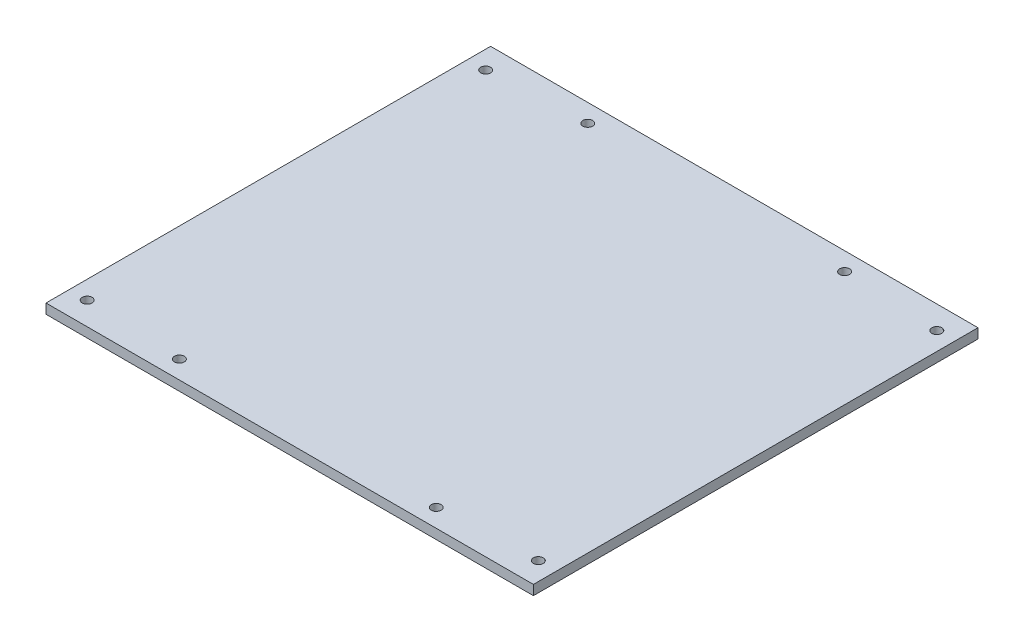
ISO-10303-21;
HEADER;
FILE_DESCRIPTION(('STEP AP214'),'2;1');
FILE_NAME('part.step','',(''),(''),'','','');
FILE_SCHEMA(('AUTOMOTIVE_DESIGN { 1 0 10303 214 1 1 1 1 }'));
ENDSEC;
DATA;
#1=APPLICATION_CONTEXT('core data for automotive mechanical design processes');
#2=APPLICATION_PROTOCOL_DEFINITION('international standard','automotive_design',2000,#1);
#3=PRODUCT_CONTEXT('',#1,'mechanical');
#4=PRODUCT('Part','Part','',(#3));
#5=PRODUCT_RELATED_PRODUCT_CATEGORY('part','',(#4));
#6=PRODUCT_DEFINITION_FORMATION('','',#4);
#7=PRODUCT_DEFINITION_CONTEXT('part definition',#1,'design');
#8=PRODUCT_DEFINITION('design','',#6,#7);
#9=PRODUCT_DEFINITION_SHAPE('','',#8);
#10=(LENGTH_UNIT() NAMED_UNIT(*) SI_UNIT(.MILLI.,.METRE.));
#11=(NAMED_UNIT(*) PLANE_ANGLE_UNIT() SI_UNIT($,.RADIAN.));
#12=(NAMED_UNIT(*) SI_UNIT($,.STERADIAN.) SOLID_ANGLE_UNIT());
#13=UNCERTAINTY_MEASURE_WITH_UNIT(LENGTH_MEASURE(1.E-05),#10,'distance_accuracy_value','');
#14=(GEOMETRIC_REPRESENTATION_CONTEXT(3) GLOBAL_UNCERTAINTY_ASSIGNED_CONTEXT((#13)) GLOBAL_UNIT_ASSIGNED_CONTEXT((#10,
#11,#12)) REPRESENTATION_CONTEXT('',''));
#15=CARTESIAN_POINT('',(0.,0.,0.));
#16=DIRECTION('',(0.,0.,1.));
#17=DIRECTION('',(1.,0.,0.));
#18=AXIS2_PLACEMENT_3D('',#15,#16,#17);
#19=CARTESIAN_POINT('',(-74.,2.9718,-60.));
#20=DIRECTION('',(1.,0.,0.));
#21=DIRECTION('',(0.,0.,-1.));
#22=AXIS2_PLACEMENT_3D('',#19,#20,#21);
#23=PLANE('',#22);
#24=DIRECTION('',(0.,0.,1.));
#25=VECTOR('',#24,1.);
#26=CARTESIAN_POINT('',(-74.,0.,-60.));
#27=LINE('',#26,#25);
#28=CARTESIAN_POINT('',(-74.,0.,-60.));
#29=VERTEX_POINT('',#28);
#30=CARTESIAN_POINT('',(-74.,0.,75.));
#31=VERTEX_POINT('',#30);
#32=EDGE_CURVE('E107',#29,#31,#27,.T.);
#33=ORIENTED_EDGE('',*,*,#32,.T.);
#34=DIRECTION('',(0.,-1.,0.));
#35=VECTOR('',#34,1.);
#36=CARTESIAN_POINT('',(-74.,2.9718,75.));
#37=LINE('',#36,#35);
#38=CARTESIAN_POINT('',(-74.,2.9718,75.));
#39=VERTEX_POINT('',#38);
#40=EDGE_CURVE('E11',#39,#31,#37,.T.);
#41=ORIENTED_EDGE('',*,*,#40,.F.);
#42=DIRECTION('',(0.,0.,1.));
#43=VECTOR('',#42,1.);
#44=CARTESIAN_POINT('',(-74.,2.9718,-60.));
#45=LINE('',#44,#43);
#46=CARTESIAN_POINT('',(-74.,2.9718,-60.));
#47=VERTEX_POINT('',#46);
#48=EDGE_CURVE('E91',#47,#39,#45,.T.);
#49=ORIENTED_EDGE('',*,*,#48,.F.);
#50=DIRECTION('',(0.,-1.,0.));
#51=VECTOR('',#50,1.);
#52=CARTESIAN_POINT('',(-74.,2.9718,-60.));
#53=LINE('',#52,#51);
#54=EDGE_CURVE('E103',#47,#29,#53,.T.);
#55=ORIENTED_EDGE('',*,*,#54,.T.);
#56=EDGE_LOOP('',(#33,#41,#49,#55));
#57=FACE_BOUND('',#56,.T.);
#58=ADVANCED_FACE('F39',(#57),#23,.F.);
#59=CARTESIAN_POINT('',(-74.,2.9718,75.));
#60=DIRECTION('',(0.,0.,-1.));
#61=DIRECTION('',(-1.,0.,0.));
#62=AXIS2_PLACEMENT_3D('',#59,#60,#61);
#63=PLANE('',#62);
#64=DIRECTION('',(1.,0.,0.));
#65=VECTOR('',#64,1.);
#66=CARTESIAN_POINT('',(-74.,0.,75.));
#67=LINE('',#66,#65);
#68=CARTESIAN_POINT('',(74.,0.,75.));
#69=VERTEX_POINT('',#68);
#70=EDGE_CURVE('E96',#31,#69,#67,.T.);
#71=ORIENTED_EDGE('',*,*,#70,.T.);
#72=DIRECTION('',(0.,-1.,0.));
#73=VECTOR('',#72,1.);
#74=CARTESIAN_POINT('',(74.,2.9718,75.));
#75=LINE('',#74,#73);
#76=CARTESIAN_POINT('',(74.,2.9718,75.));
#77=VERTEX_POINT('',#76);
#78=EDGE_CURVE('E48',#77,#69,#75,.T.);
#79=ORIENTED_EDGE('',*,*,#78,.F.);
#80=DIRECTION('',(1.,0.,0.));
#81=VECTOR('',#80,1.);
#82=CARTESIAN_POINT('',(-74.,2.9718,75.));
#83=LINE('',#82,#81);
#84=EDGE_CURVE('E86',#39,#77,#83,.T.);
#85=ORIENTED_EDGE('',*,*,#84,.F.);
#86=ORIENTED_EDGE('',*,*,#40,.T.);
#87=EDGE_LOOP('',(#71,#79,#85,#86));
#88=FACE_BOUND('',#87,.T.);
#89=ADVANCED_FACE('F95',(#88),#63,.F.);
#90=CARTESIAN_POINT('',(74.,2.9718,-60.));
#91=DIRECTION('',(-1.,0.,0.));
#92=DIRECTION('',(0.,0.,1.));
#93=AXIS2_PLACEMENT_3D('',#90,#91,#92);
#94=PLANE('',#93);
#95=DIRECTION('',(0.,0.,-1.));
#96=VECTOR('',#95,1.);
#97=CARTESIAN_POINT('',(74.,0.,-60.));
#98=LINE('',#97,#96);
#99=CARTESIAN_POINT('',(74.,0.,-60.));
#100=VERTEX_POINT('',#99);
#101=EDGE_CURVE('E73',#69,#100,#98,.T.);
#102=ORIENTED_EDGE('',*,*,#101,.T.);
#103=DIRECTION('',(0.,-1.,0.));
#104=VECTOR('',#103,1.);
#105=CARTESIAN_POINT('',(74.,2.9718,-60.));
#106=LINE('',#105,#104);
#107=CARTESIAN_POINT('',(74.,2.9718,-60.));
#108=VERTEX_POINT('',#107);
#109=EDGE_CURVE('E98',#108,#100,#106,.T.);
#110=ORIENTED_EDGE('',*,*,#109,.F.);
#111=DIRECTION('',(0.,0.,-1.));
#112=VECTOR('',#111,1.);
#113=CARTESIAN_POINT('',(74.,2.9718,-60.));
#114=LINE('',#113,#112);
#115=EDGE_CURVE('E89',#77,#108,#114,.T.);
#116=ORIENTED_EDGE('',*,*,#115,.F.);
#117=ORIENTED_EDGE('',*,*,#78,.T.);
#118=EDGE_LOOP('',(#102,#110,#116,#117));
#119=FACE_BOUND('',#118,.T.);
#120=ADVANCED_FACE('F99',(#119),#94,.F.);
#121=CARTESIAN_POINT('',(-74.,2.9718,-60.));
#122=DIRECTION('',(0.,0.,1.));
#123=DIRECTION('',(1.,0.,0.));
#124=AXIS2_PLACEMENT_3D('',#121,#122,#123);
#125=PLANE('',#124);
#126=DIRECTION('',(-1.,0.,0.));
#127=VECTOR('',#126,1.);
#128=CARTESIAN_POINT('',(-74.,0.,-60.));
#129=LINE('',#128,#127);
#130=EDGE_CURVE('E79',#100,#29,#129,.T.);
#131=ORIENTED_EDGE('',*,*,#130,.T.);
#132=ORIENTED_EDGE('',*,*,#54,.F.);
#133=DIRECTION('',(-1.,0.,0.));
#134=VECTOR('',#133,1.);
#135=CARTESIAN_POINT('',(-74.,2.9718,-60.));
#136=LINE('',#135,#134);
#137=EDGE_CURVE('E56',#108,#47,#136,.T.);
#138=ORIENTED_EDGE('',*,*,#137,.F.);
#139=ORIENTED_EDGE('',*,*,#109,.T.);
#140=EDGE_LOOP('',(#131,#132,#138,#139));
#141=FACE_BOUND('',#140,.T.);
#142=ADVANCED_FACE('F121',(#141),#125,.F.);
#143=CARTESIAN_POINT('',(0.,2.9718,0.));
#144=DIRECTION('',(0.,1.,0.));
#145=DIRECTION('',(0.,0.,1.));
#146=AXIS2_PLACEMENT_3D('',#143,#144,#145);
#147=PLANE('',#146);
#148=CARTESIAN_POINT('',(-68.5,2.9718,68.));
#149=DIRECTION('',(0.,1.,0.));
#150=DIRECTION('',(0.,0.,1.));
#151=AXIS2_PLACEMENT_3D('',#148,#149,#150);
#152=CIRCLE('',#151,1.5);
#153=CARTESIAN_POINT('',(-68.5,2.9718,69.5));
#154=VERTEX_POINT('',#153);
#155=EDGE_CURVE('E161',#154,#154,#152,.T.);
#156=ORIENTED_EDGE('',*,*,#155,.F.);
#157=EDGE_LOOP('',(#156));
#158=FACE_BOUND('',#157,.T.);
#159=CARTESIAN_POINT('',(68.5,2.9718,67.9999999999999));
#160=DIRECTION('',(0.,1.,0.));
#161=DIRECTION('',(0.,0.,-1.));
#162=AXIS2_PLACEMENT_3D('',#159,#160,#161);
#163=CIRCLE('',#162,1.5);
#164=CARTESIAN_POINT('',(68.5,2.9718,66.4999999999999));
#165=VERTEX_POINT('',#164);
#166=EDGE_CURVE('E153',#165,#165,#163,.T.);
#167=ORIENTED_EDGE('',*,*,#166,.F.);
#168=EDGE_LOOP('',(#167));
#169=FACE_BOUND('',#168,.T.);
#170=CARTESIAN_POINT('',(68.5,2.9718,-53.));
#171=DIRECTION('',(0.,1.,0.));
#172=DIRECTION('',(0.,0.,-1.));
#173=AXIS2_PLACEMENT_3D('',#170,#171,#172);
#174=CIRCLE('',#173,1.5);
#175=CARTESIAN_POINT('',(68.5,2.9718,-54.5));
#176=VERTEX_POINT('',#175);
#177=EDGE_CURVE('E145',#176,#176,#174,.T.);
#178=ORIENTED_EDGE('',*,*,#177,.F.);
#179=EDGE_LOOP('',(#178));
#180=FACE_BOUND('',#179,.T.);
#181=CARTESIAN_POINT('',(-39.,2.9718,-54.5));
#182=DIRECTION('',(0.,1.,0.));
#183=DIRECTION('',(0.,0.,1.));
#184=AXIS2_PLACEMENT_3D('',#181,#182,#183);
#185=CIRCLE('',#184,1.5);
#186=CARTESIAN_POINT('',(-39.,2.9718,-53.));
#187=VERTEX_POINT('',#186);
#188=EDGE_CURVE('E136',#187,#187,#185,.T.);
#189=ORIENTED_EDGE('',*,*,#188,.F.);
#190=EDGE_LOOP('',(#189));
#191=FACE_BOUND('',#190,.T.);
#192=CARTESIAN_POINT('',(39.,2.9718,69.5));
#193=DIRECTION('',(0.,1.,0.));
#194=DIRECTION('',(0.,0.,1.));
#195=AXIS2_PLACEMENT_3D('',#192,#193,#194);
#196=CIRCLE('',#195,1.5);
#197=CARTESIAN_POINT('',(39.,2.9718,71.));
#198=VERTEX_POINT('',#197);
#199=EDGE_CURVE('E184',#198,#198,#196,.T.);
#200=ORIENTED_EDGE('',*,*,#199,.F.);
#201=EDGE_LOOP('',(#200));
#202=FACE_BOUND('',#201,.T.);
#203=CARTESIAN_POINT('',(-39.,2.9718,69.5));
#204=DIRECTION('',(0.,1.,0.));
#205=DIRECTION('',(0.,0.,1.));
#206=AXIS2_PLACEMENT_3D('',#203,#204,#205);
#207=CIRCLE('',#206,1.5);
#208=CARTESIAN_POINT('',(-39.,2.9718,71.));
#209=VERTEX_POINT('',#208);
#210=EDGE_CURVE('E168',#209,#209,#207,.T.);
#211=ORIENTED_EDGE('',*,*,#210,.F.);
#212=EDGE_LOOP('',(#211));
#213=FACE_BOUND('',#212,.T.);
#214=CARTESIAN_POINT('',(39.,2.9718,-54.5));
#215=DIRECTION('',(0.,1.,0.));
#216=DIRECTION('',(0.,0.,1.));
#217=AXIS2_PLACEMENT_3D('',#214,#215,#216);
#218=CIRCLE('',#217,1.5);
#219=CARTESIAN_POINT('',(39.,2.9718,-53.));
#220=VERTEX_POINT('',#219);
#221=EDGE_CURVE('E177',#220,#220,#218,.T.);
#222=ORIENTED_EDGE('',*,*,#221,.F.);
#223=EDGE_LOOP('',(#222));
#224=FACE_BOUND('',#223,.T.);
#225=CARTESIAN_POINT('',(-68.5,2.9718,-53.));
#226=DIRECTION('',(0.,1.,0.));
#227=DIRECTION('',(0.,0.,1.));
#228=AXIS2_PLACEMENT_3D('',#225,#226,#227);
#229=CIRCLE('',#228,1.5);
#230=CARTESIAN_POINT('',(-68.5,2.9718,-51.5));
#231=VERTEX_POINT('',#230);
#232=EDGE_CURVE('E128',#231,#231,#229,.T.);
#233=ORIENTED_EDGE('',*,*,#232,.F.);
#234=EDGE_LOOP('',(#233));
#235=FACE_BOUND('',#234,.T.);
#236=ORIENTED_EDGE('',*,*,#48,.T.);
#237=ORIENTED_EDGE('',*,*,#84,.T.);
#238=ORIENTED_EDGE('',*,*,#115,.T.);
#239=ORIENTED_EDGE('',*,*,#137,.T.);
#240=EDGE_LOOP('',(#236,#237,#238,#239));
#241=FACE_BOUND('',#240,.T.);
#242=ADVANCED_FACE('F87',(#158,#169,#180,#191,#202,#213,#224,#235,#241),#147,.T.);
#243=CARTESIAN_POINT('',(0.,0.,0.));
#244=DIRECTION('',(0.,1.,0.));
#245=DIRECTION('',(0.,0.,1.));
#246=AXIS2_PLACEMENT_3D('',#243,#244,#245);
#247=PLANE('',#246);
#248=CARTESIAN_POINT('',(-68.5,0.,68.));
#249=DIRECTION('',(0.,1.,0.));
#250=DIRECTION('',(0.,0.,1.));
#251=AXIS2_PLACEMENT_3D('',#248,#249,#250);
#252=CIRCLE('',#251,1.5);
#253=CARTESIAN_POINT('',(-68.5,0.,69.5));
#254=VERTEX_POINT('',#253);
#255=EDGE_CURVE('E132',#254,#254,#252,.T.);
#256=ORIENTED_EDGE('',*,*,#255,.T.);
#257=EDGE_LOOP('',(#256));
#258=FACE_BOUND('',#257,.T.);
#259=CARTESIAN_POINT('',(68.5,0.,67.9999999999999));
#260=DIRECTION('',(0.,1.,0.));
#261=DIRECTION('',(0.,0.,-1.));
#262=AXIS2_PLACEMENT_3D('',#259,#260,#261);
#263=CIRCLE('',#262,1.5);
#264=CARTESIAN_POINT('',(68.5,0.,66.4999999999999));
#265=VERTEX_POINT('',#264);
#266=EDGE_CURVE('E157',#265,#265,#263,.T.);
#267=ORIENTED_EDGE('',*,*,#266,.T.);
#268=EDGE_LOOP('',(#267));
#269=FACE_BOUND('',#268,.T.);
#270=CARTESIAN_POINT('',(68.5,0.,-53.));
#271=DIRECTION('',(0.,1.,0.));
#272=DIRECTION('',(0.,0.,-1.));
#273=AXIS2_PLACEMENT_3D('',#270,#271,#272);
#274=CIRCLE('',#273,1.5);
#275=CARTESIAN_POINT('',(68.5,0.,-54.5));
#276=VERTEX_POINT('',#275);
#277=EDGE_CURVE('E149',#276,#276,#274,.T.);
#278=ORIENTED_EDGE('',*,*,#277,.T.);
#279=EDGE_LOOP('',(#278));
#280=FACE_BOUND('',#279,.T.);
#281=CARTESIAN_POINT('',(-39.,0.,-54.5));
#282=DIRECTION('',(0.,1.,0.));
#283=DIRECTION('',(0.,0.,1.));
#284=AXIS2_PLACEMENT_3D('',#281,#282,#283);
#285=CIRCLE('',#284,1.5);
#286=CARTESIAN_POINT('',(-39.,0.,-53.));
#287=VERTEX_POINT('',#286);
#288=EDGE_CURVE('E140',#287,#287,#285,.T.);
#289=ORIENTED_EDGE('',*,*,#288,.T.);
#290=EDGE_LOOP('',(#289));
#291=FACE_BOUND('',#290,.T.);
#292=CARTESIAN_POINT('',(39.,0.,69.5));
#293=DIRECTION('',(0.,1.,0.));
#294=DIRECTION('',(0.,0.,1.));
#295=AXIS2_PLACEMENT_3D('',#292,#293,#294);
#296=CIRCLE('',#295,1.5);
#297=CARTESIAN_POINT('',(39.,0.,71.));
#298=VERTEX_POINT('',#297);
#299=EDGE_CURVE('E173',#298,#298,#296,.T.);
#300=ORIENTED_EDGE('',*,*,#299,.T.);
#301=EDGE_LOOP('',(#300));
#302=FACE_BOUND('',#301,.T.);
#303=CARTESIAN_POINT('',(-39.,0.,69.5));
#304=DIRECTION('',(0.,1.,0.));
#305=DIRECTION('',(0.,0.,1.));
#306=AXIS2_PLACEMENT_3D('',#303,#304,#305);
#307=CIRCLE('',#306,1.5);
#308=CARTESIAN_POINT('',(-39.,0.,71.));
#309=VERTEX_POINT('',#308);
#310=EDGE_CURVE('E172',#309,#309,#307,.T.);
#311=ORIENTED_EDGE('',*,*,#310,.T.);
#312=EDGE_LOOP('',(#311));
#313=FACE_BOUND('',#312,.T.);
#314=CARTESIAN_POINT('',(39.,0.,-54.5));
#315=DIRECTION('',(0.,1.,0.));
#316=DIRECTION('',(0.,0.,1.));
#317=AXIS2_PLACEMENT_3D('',#314,#315,#316);
#318=CIRCLE('',#317,1.5);
#319=CARTESIAN_POINT('',(39.,0.,-53.));
#320=VERTEX_POINT('',#319);
#321=EDGE_CURVE('E141',#320,#320,#318,.T.);
#322=ORIENTED_EDGE('',*,*,#321,.T.);
#323=EDGE_LOOP('',(#322));
#324=FACE_BOUND('',#323,.T.);
#325=CARTESIAN_POINT('',(-68.5,0.,-53.));
#326=DIRECTION('',(0.,1.,0.));
#327=DIRECTION('',(0.,0.,1.));
#328=AXIS2_PLACEMENT_3D('',#325,#326,#327);
#329=CIRCLE('',#328,1.5);
#330=CARTESIAN_POINT('',(-68.5,0.,-51.5));
#331=VERTEX_POINT('',#330);
#332=EDGE_CURVE('E111',#331,#331,#329,.T.);
#333=ORIENTED_EDGE('',*,*,#332,.T.);
#334=EDGE_LOOP('',(#333));
#335=FACE_BOUND('',#334,.T.);
#336=ORIENTED_EDGE('',*,*,#32,.F.);
#337=ORIENTED_EDGE('',*,*,#130,.F.);
#338=ORIENTED_EDGE('',*,*,#101,.F.);
#339=ORIENTED_EDGE('',*,*,#70,.F.);
#340=EDGE_LOOP('',(#336,#337,#338,#339));
#341=FACE_BOUND('',#340,.T.);
#342=ADVANCED_FACE('F124',(#258,#269,#280,#291,#302,#313,#324,#335,#341),#247,.F.);
#343=CARTESIAN_POINT('',(-68.5,0.,-53.));
#344=DIRECTION('',(0.,1.,0.));
#345=DIRECTION('',(0.,0.,1.));
#346=AXIS2_PLACEMENT_3D('',#343,#344,#345);
#347=CYLINDRICAL_SURFACE('',#346,1.5);
#348=ORIENTED_EDGE('',*,*,#332,.F.);
#349=EDGE_LOOP('',(#348));
#350=FACE_BOUND('',#349,.T.);
#351=ORIENTED_EDGE('',*,*,#232,.T.);
#352=EDGE_LOOP('',(#351));
#353=FACE_BOUND('',#352,.T.);
#354=ADVANCED_FACE('F212',(#350,#353),#347,.F.);
#355=CARTESIAN_POINT('',(39.,0.,-54.5));
#356=DIRECTION('',(0.,1.,0.));
#357=DIRECTION('',(0.,0.,1.));
#358=AXIS2_PLACEMENT_3D('',#355,#356,#357);
#359=CYLINDRICAL_SURFACE('',#358,1.5);
#360=ORIENTED_EDGE('',*,*,#321,.F.);
#361=EDGE_LOOP('',(#360));
#362=FACE_BOUND('',#361,.T.);
#363=ORIENTED_EDGE('',*,*,#221,.T.);
#364=EDGE_LOOP('',(#363));
#365=FACE_BOUND('',#364,.T.);
#366=ADVANCED_FACE('F214',(#362,#365),#359,.F.);
#367=CARTESIAN_POINT('',(-39.,0.,69.5));
#368=DIRECTION('',(0.,1.,0.));
#369=DIRECTION('',(0.,0.,1.));
#370=AXIS2_PLACEMENT_3D('',#367,#368,#369);
#371=CYLINDRICAL_SURFACE('',#370,1.5);
#372=ORIENTED_EDGE('',*,*,#310,.F.);
#373=EDGE_LOOP('',(#372));
#374=FACE_BOUND('',#373,.T.);
#375=ORIENTED_EDGE('',*,*,#210,.T.);
#376=EDGE_LOOP('',(#375));
#377=FACE_BOUND('',#376,.T.);
#378=ADVANCED_FACE('F198',(#374,#377),#371,.F.);
#379=CARTESIAN_POINT('',(39.,0.,69.5));
#380=DIRECTION('',(0.,1.,0.));
#381=DIRECTION('',(0.,0.,1.));
#382=AXIS2_PLACEMENT_3D('',#379,#380,#381);
#383=CYLINDRICAL_SURFACE('',#382,1.5);
#384=ORIENTED_EDGE('',*,*,#299,.F.);
#385=EDGE_LOOP('',(#384));
#386=FACE_BOUND('',#385,.T.);
#387=ORIENTED_EDGE('',*,*,#199,.T.);
#388=EDGE_LOOP('',(#387));
#389=FACE_BOUND('',#388,.T.);
#390=ADVANCED_FACE('F194',(#386,#389),#383,.F.);
#391=CARTESIAN_POINT('',(-39.,0.,-54.5));
#392=DIRECTION('',(0.,1.,0.));
#393=DIRECTION('',(0.,0.,1.));
#394=AXIS2_PLACEMENT_3D('',#391,#392,#393);
#395=CYLINDRICAL_SURFACE('',#394,1.5);
#396=ORIENTED_EDGE('',*,*,#288,.F.);
#397=EDGE_LOOP('',(#396));
#398=FACE_BOUND('',#397,.T.);
#399=ORIENTED_EDGE('',*,*,#188,.T.);
#400=EDGE_LOOP('',(#399));
#401=FACE_BOUND('',#400,.T.);
#402=ADVANCED_FACE('F197',(#398,#401),#395,.F.);
#403=CARTESIAN_POINT('',(68.5,0.,-53.));
#404=DIRECTION('',(0.,1.,0.));
#405=DIRECTION('',(0.,0.,1.));
#406=AXIS2_PLACEMENT_3D('',#403,#404,#405);
#407=CYLINDRICAL_SURFACE('',#406,1.5);
#408=ORIENTED_EDGE('',*,*,#277,.F.);
#409=EDGE_LOOP('',(#408));
#410=FACE_BOUND('',#409,.T.);
#411=ORIENTED_EDGE('',*,*,#177,.T.);
#412=EDGE_LOOP('',(#411));
#413=FACE_BOUND('',#412,.T.);
#414=ADVANCED_FACE('F283',(#410,#413),#407,.F.);
#415=CARTESIAN_POINT('',(68.5,0.,67.9999999999999));
#416=DIRECTION('',(0.,1.,0.));
#417=DIRECTION('',(0.,0.,1.));
#418=AXIS2_PLACEMENT_3D('',#415,#416,#417);
#419=CYLINDRICAL_SURFACE('',#418,1.5);
#420=ORIENTED_EDGE('',*,*,#266,.F.);
#421=EDGE_LOOP('',(#420));
#422=FACE_BOUND('',#421,.T.);
#423=ORIENTED_EDGE('',*,*,#166,.T.);
#424=EDGE_LOOP('',(#423));
#425=FACE_BOUND('',#424,.T.);
#426=ADVANCED_FACE('F292',(#422,#425),#419,.F.);
#427=CARTESIAN_POINT('',(-68.5,0.,68.));
#428=DIRECTION('',(0.,1.,0.));
#429=DIRECTION('',(0.,0.,1.));
#430=AXIS2_PLACEMENT_3D('',#427,#428,#429);
#431=CYLINDRICAL_SURFACE('',#430,1.5);
#432=ORIENTED_EDGE('',*,*,#255,.F.);
#433=EDGE_LOOP('',(#432));
#434=FACE_BOUND('',#433,.T.);
#435=ORIENTED_EDGE('',*,*,#155,.T.);
#436=EDGE_LOOP('',(#435));
#437=FACE_BOUND('',#436,.T.);
#438=ADVANCED_FACE('F302',(#434,#437),#431,.F.);
#439=CLOSED_SHELL('',(#58,#89,#120,#142,#242,#342,#354,#366,#378,#390,#402,#414,#426,#438));
#440=MANIFOLD_SOLID_BREP('B2',#439);
#441=ADVANCED_BREP_SHAPE_REPRESENTATION('',(#18,#440),#14);
#442=SHAPE_DEFINITION_REPRESENTATION(#9,#441);
ENDSEC;
END-ISO-10303-21;
